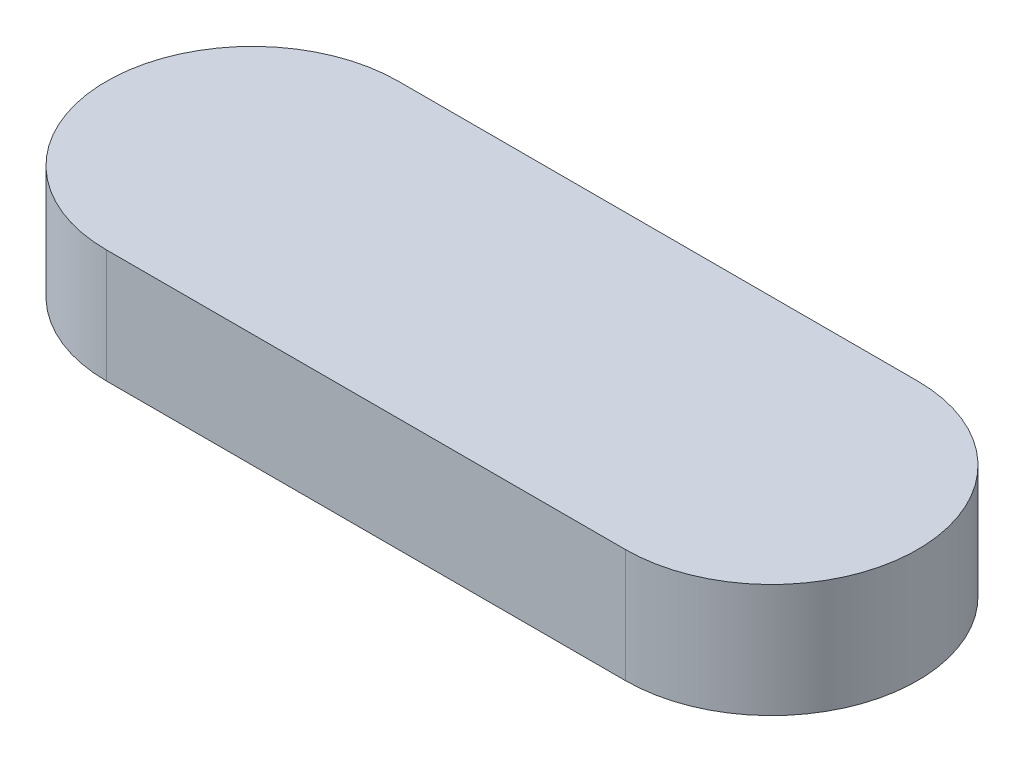
ISO-10303-21;
HEADER;
FILE_DESCRIPTION(('STEP AP214'),'2;1');
FILE_NAME('part.step','',(''),(''),'','','');
FILE_SCHEMA(('AUTOMOTIVE_DESIGN { 1 0 10303 214 1 1 1 1 }'));
ENDSEC;
DATA;
#1=APPLICATION_CONTEXT('core data for automotive mechanical design processes');
#2=APPLICATION_PROTOCOL_DEFINITION('international standard','automotive_design',2000,#1);
#3=PRODUCT_CONTEXT('',#1,'mechanical');
#4=PRODUCT('Part','Part','',(#3));
#5=PRODUCT_RELATED_PRODUCT_CATEGORY('part','',(#4));
#6=PRODUCT_DEFINITION_FORMATION('','',#4);
#7=PRODUCT_DEFINITION_CONTEXT('part definition',#1,'design');
#8=PRODUCT_DEFINITION('design','',#6,#7);
#9=PRODUCT_DEFINITION_SHAPE('','',#8);
#10=(LENGTH_UNIT() NAMED_UNIT(*) SI_UNIT(.MILLI.,.METRE.));
#11=(NAMED_UNIT(*) PLANE_ANGLE_UNIT() SI_UNIT($,.RADIAN.));
#12=(NAMED_UNIT(*) SI_UNIT($,.STERADIAN.) SOLID_ANGLE_UNIT());
#13=UNCERTAINTY_MEASURE_WITH_UNIT(LENGTH_MEASURE(1.E-05),#10,'distance_accuracy_value','');
#14=(GEOMETRIC_REPRESENTATION_CONTEXT(3) GLOBAL_UNCERTAINTY_ASSIGNED_CONTEXT((#13)) GLOBAL_UNIT_ASSIGNED_CONTEXT((#10,
#11,#12)) REPRESENTATION_CONTEXT('',''));
#15=CARTESIAN_POINT('',(0.,0.,0.));
#16=DIRECTION('',(0.,0.,1.));
#17=DIRECTION('',(1.,0.,0.));
#18=AXIS2_PLACEMENT_3D('',#15,#16,#17);
#19=CARTESIAN_POINT('',(-16.,7.,0.));
#20=DIRECTION('',(0.,-1.,0.));
#21=DIRECTION('',(0.,0.,-1.));
#22=AXIS2_PLACEMENT_3D('',#19,#20,#21);
#23=CYLINDRICAL_SURFACE('',#22,9.);
#24=CARTESIAN_POINT('',(-16.,0.,0.));
#25=DIRECTION('',(0.,1.,0.));
#26=DIRECTION('',(0.,0.,1.));
#27=AXIS2_PLACEMENT_3D('',#24,#25,#26);
#28=CIRCLE('',#27,9.);
#29=CARTESIAN_POINT('',(-16.,0.,-9.));
#30=VERTEX_POINT('',#29);
#31=CARTESIAN_POINT('',(-16.,0.,9.));
#32=VERTEX_POINT('',#31);
#33=EDGE_CURVE('E96',#30,#32,#28,.T.);
#34=ORIENTED_EDGE('',*,*,#33,.T.);
#35=DIRECTION('',(0.,-1.,0.));
#36=VECTOR('',#35,1.);
#37=CARTESIAN_POINT('',(-16.,7.,9.));
#38=LINE('',#37,#36);
#39=CARTESIAN_POINT('',(-16.,7.,9.));
#40=VERTEX_POINT('',#39);
#41=EDGE_CURVE('E11',#40,#32,#38,.T.);
#42=ORIENTED_EDGE('',*,*,#41,.F.);
#43=CARTESIAN_POINT('',(-16.,7.,0.));
#44=DIRECTION('',(0.,1.,0.));
#45=DIRECTION('',(0.,0.,1.));
#46=AXIS2_PLACEMENT_3D('',#43,#44,#45);
#47=CIRCLE('',#46,9.);
#48=CARTESIAN_POINT('',(-16.,7.,-9.));
#49=VERTEX_POINT('',#48);
#50=EDGE_CURVE('E84',#49,#40,#47,.T.);
#51=ORIENTED_EDGE('',*,*,#50,.F.);
#52=DIRECTION('',(0.,-1.,0.));
#53=VECTOR('',#52,1.);
#54=CARTESIAN_POINT('',(-16.,7.,-9.));
#55=LINE('',#54,#53);
#56=EDGE_CURVE('E92',#49,#30,#55,.T.);
#57=ORIENTED_EDGE('',*,*,#56,.T.);
#58=EDGE_LOOP('',(#34,#42,#51,#57));
#59=FACE_BOUND('',#58,.T.);
#60=ADVANCED_FACE('F33',(#59),#23,.T.);
#61=CARTESIAN_POINT('',(-16.,7.,9.));
#62=DIRECTION('',(0.,0.,-1.));
#63=DIRECTION('',(-1.,0.,0.));
#64=AXIS2_PLACEMENT_3D('',#61,#62,#63);
#65=PLANE('',#64);
#66=DIRECTION('',(1.,0.,0.));
#67=VECTOR('',#66,1.);
#68=CARTESIAN_POINT('',(-16.,0.,9.));
#69=LINE('',#68,#67);
#70=CARTESIAN_POINT('',(16.,0.,8.99999999999999));
#71=VERTEX_POINT('',#70);
#72=EDGE_CURVE('E88',#32,#71,#69,.T.);
#73=ORIENTED_EDGE('',*,*,#72,.T.);
#74=DIRECTION('',(0.,-1.,0.));
#75=VECTOR('',#74,1.);
#76=CARTESIAN_POINT('',(16.,7.,8.99999999999999));
#77=LINE('',#76,#75);
#78=CARTESIAN_POINT('',(16.,7.,8.99999999999999));
#79=VERTEX_POINT('',#78);
#80=EDGE_CURVE('E41',#79,#71,#77,.T.);
#81=ORIENTED_EDGE('',*,*,#80,.F.);
#82=DIRECTION('',(1.,0.,0.));
#83=VECTOR('',#82,1.);
#84=CARTESIAN_POINT('',(-16.,7.,9.));
#85=LINE('',#84,#83);
#86=EDGE_CURVE('E79',#40,#79,#85,.T.);
#87=ORIENTED_EDGE('',*,*,#86,.F.);
#88=ORIENTED_EDGE('',*,*,#41,.T.);
#89=EDGE_LOOP('',(#73,#81,#87,#88));
#90=FACE_BOUND('',#89,.T.);
#91=ADVANCED_FACE('F87',(#90),#65,.F.);
#92=CARTESIAN_POINT('',(16.,7.,0.));
#93=DIRECTION('',(0.,-1.,0.));
#94=DIRECTION('',(0.,0.,-1.));
#95=AXIS2_PLACEMENT_3D('',#92,#93,#94);
#96=CYLINDRICAL_SURFACE('',#95,9.);
#97=CARTESIAN_POINT('',(16.,0.,0.));
#98=DIRECTION('',(0.,1.,0.));
#99=DIRECTION('',(0.,0.,1.));
#100=AXIS2_PLACEMENT_3D('',#97,#98,#99);
#101=CIRCLE('',#100,9.);
#102=CARTESIAN_POINT('',(16.,0.,-9.00000000000001));
#103=VERTEX_POINT('',#102);
#104=EDGE_CURVE('E66',#71,#103,#101,.T.);
#105=ORIENTED_EDGE('',*,*,#104,.T.);
#106=DIRECTION('',(0.,-1.,0.));
#107=VECTOR('',#106,1.);
#108=CARTESIAN_POINT('',(16.,7.,-9.00000000000001));
#109=LINE('',#108,#107);
#110=CARTESIAN_POINT('',(16.,7.,-9.00000000000001));
#111=VERTEX_POINT('',#110);
#112=EDGE_CURVE('E89',#111,#103,#109,.T.);
#113=ORIENTED_EDGE('',*,*,#112,.F.);
#114=CARTESIAN_POINT('',(16.,7.,0.));
#115=DIRECTION('',(0.,1.,0.));
#116=DIRECTION('',(0.,0.,1.));
#117=AXIS2_PLACEMENT_3D('',#114,#115,#116);
#118=CIRCLE('',#117,9.);
#119=EDGE_CURVE('E82',#79,#111,#118,.T.);
#120=ORIENTED_EDGE('',*,*,#119,.F.);
#121=ORIENTED_EDGE('',*,*,#80,.T.);
#122=EDGE_LOOP('',(#105,#113,#120,#121));
#123=FACE_BOUND('',#122,.T.);
#124=ADVANCED_FACE('F90',(#123),#96,.T.);
#125=CARTESIAN_POINT('',(-16.,7.,-9.));
#126=DIRECTION('',(0.,0.,1.));
#127=DIRECTION('',(1.,0.,0.));
#128=AXIS2_PLACEMENT_3D('',#125,#126,#127);
#129=PLANE('',#128);
#130=DIRECTION('',(-1.,0.,0.));
#131=VECTOR('',#130,1.);
#132=CARTESIAN_POINT('',(-16.,0.,-9.));
#133=LINE('',#132,#131);
#134=EDGE_CURVE('E72',#103,#30,#133,.T.);
#135=ORIENTED_EDGE('',*,*,#134,.T.);
#136=ORIENTED_EDGE('',*,*,#56,.F.);
#137=DIRECTION('',(-1.,0.,0.));
#138=VECTOR('',#137,1.);
#139=CARTESIAN_POINT('',(-16.,7.,-9.));
#140=LINE('',#139,#138);
#141=EDGE_CURVE('E49',#111,#49,#140,.T.);
#142=ORIENTED_EDGE('',*,*,#141,.F.);
#143=ORIENTED_EDGE('',*,*,#112,.T.);
#144=EDGE_LOOP('',(#135,#136,#142,#143));
#145=FACE_BOUND('',#144,.T.);
#146=ADVANCED_FACE('F103',(#145),#129,.F.);
#147=CARTESIAN_POINT('',(-16.,7.,0.));
#148=DIRECTION('',(0.,1.,0.));
#149=DIRECTION('',(0.,0.,1.));
#150=AXIS2_PLACEMENT_3D('',#147,#148,#149);
#151=PLANE('',#150);
#152=ORIENTED_EDGE('',*,*,#50,.T.);
#153=ORIENTED_EDGE('',*,*,#86,.T.);
#154=ORIENTED_EDGE('',*,*,#119,.T.);
#155=ORIENTED_EDGE('',*,*,#141,.T.);
#156=EDGE_LOOP('',(#152,#153,#154,#155));
#157=FACE_BOUND('',#156,.T.);
#158=ADVANCED_FACE('F80',(#157),#151,.T.);
#159=CARTESIAN_POINT('',(-16.,0.,0.));
#160=DIRECTION('',(0.,1.,0.));
#161=DIRECTION('',(0.,0.,1.));
#162=AXIS2_PLACEMENT_3D('',#159,#160,#161);
#163=PLANE('',#162);
#164=ORIENTED_EDGE('',*,*,#33,.F.);
#165=ORIENTED_EDGE('',*,*,#134,.F.);
#166=ORIENTED_EDGE('',*,*,#104,.F.);
#167=ORIENTED_EDGE('',*,*,#72,.F.);
#168=EDGE_LOOP('',(#164,#165,#166,#167));
#169=FACE_BOUND('',#168,.T.);
#170=ADVANCED_FACE('F106',(#169),#163,.F.);
#171=CLOSED_SHELL('',(#60,#91,#124,#146,#158,#170));
#172=MANIFOLD_SOLID_BREP('B2',#171);
#173=ADVANCED_BREP_SHAPE_REPRESENTATION('',(#18,#172),#14);
#174=SHAPE_DEFINITION_REPRESENTATION(#9,#173);
ENDSEC;
END-ISO-10303-21;
